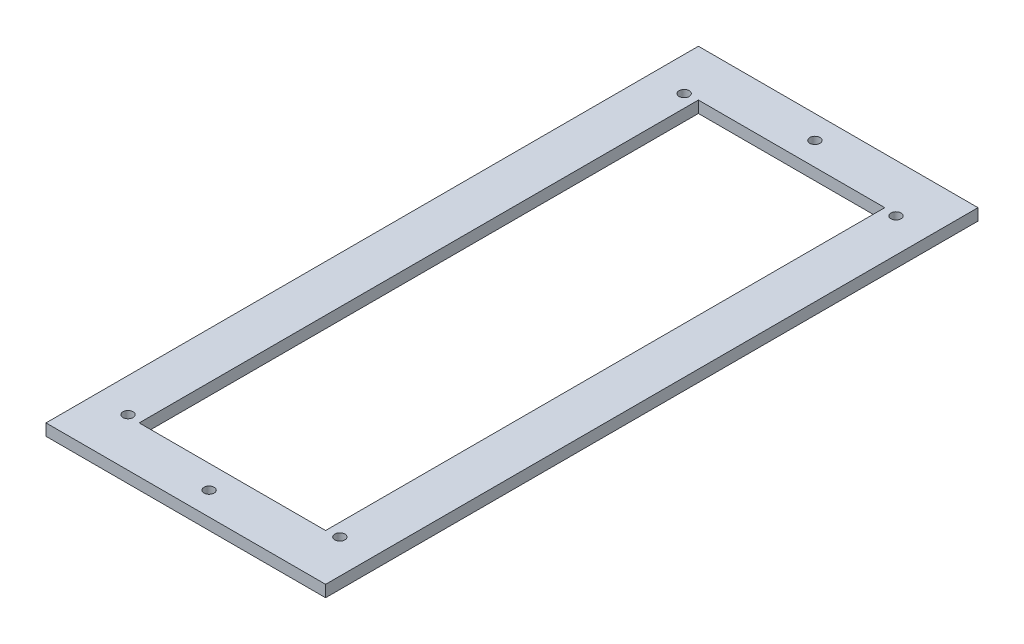
ISO-10303-21;
HEADER;
FILE_DESCRIPTION(('STEP AP214'),'2;1');
FILE_NAME('part.step','',(''),(''),'','','');
FILE_SCHEMA(('AUTOMOTIVE_DESIGN { 1 0 10303 214 1 1 1 1 }'));
ENDSEC;
DATA;
#1=APPLICATION_CONTEXT('core data for automotive mechanical design processes');
#2=APPLICATION_PROTOCOL_DEFINITION('international standard','automotive_design',2000,#1);
#3=PRODUCT_CONTEXT('',#1,'mechanical');
#4=PRODUCT('Part','Part','',(#3));
#5=PRODUCT_RELATED_PRODUCT_CATEGORY('part','',(#4));
#6=PRODUCT_DEFINITION_FORMATION('','',#4);
#7=PRODUCT_DEFINITION_CONTEXT('part definition',#1,'design');
#8=PRODUCT_DEFINITION('design','',#6,#7);
#9=PRODUCT_DEFINITION_SHAPE('','',#8);
#10=(LENGTH_UNIT() NAMED_UNIT(*) SI_UNIT(.MILLI.,.METRE.));
#11=(NAMED_UNIT(*) PLANE_ANGLE_UNIT() SI_UNIT($,.RADIAN.));
#12=(NAMED_UNIT(*) SI_UNIT($,.STERADIAN.) SOLID_ANGLE_UNIT());
#13=UNCERTAINTY_MEASURE_WITH_UNIT(LENGTH_MEASURE(1.E-05),#10,'distance_accuracy_value','');
#14=(GEOMETRIC_REPRESENTATION_CONTEXT(3) GLOBAL_UNCERTAINTY_ASSIGNED_CONTEXT((#13)) GLOBAL_UNIT_ASSIGNED_CONTEXT((#10,
#11,#12)) REPRESENTATION_CONTEXT('',''));
#15=CARTESIAN_POINT('',(0.,0.,0.));
#16=DIRECTION('',(0.,0.,1.));
#17=DIRECTION('',(1.,0.,0.));
#18=AXIS2_PLACEMENT_3D('',#15,#16,#17);
#19=CARTESIAN_POINT('',(-38.1,3.175,0.));
#20=DIRECTION('',(1.,0.,0.));
#21=DIRECTION('',(0.,0.,-1.));
#22=AXIS2_PLACEMENT_3D('',#19,#20,#21);
#23=PLANE('',#22);
#24=DIRECTION('',(0.,0.,1.));
#25=VECTOR('',#24,1.);
#26=CARTESIAN_POINT('',(-38.1,0.,0.));
#27=LINE('',#26,#25);
#28=CARTESIAN_POINT('',(-38.1,0.,0.));
#29=VERTEX_POINT('',#28);
#30=CARTESIAN_POINT('',(-38.1,0.,177.8));
#31=VERTEX_POINT('',#30);
#32=EDGE_CURVE('E143',#29,#31,#27,.T.);
#33=ORIENTED_EDGE('',*,*,#32,.T.);
#34=DIRECTION('',(0.,-1.,0.));
#35=VECTOR('',#34,1.);
#36=CARTESIAN_POINT('',(-38.1,3.175,177.8));
#37=LINE('',#36,#35);
#38=CARTESIAN_POINT('',(-38.1,3.175,177.8));
#39=VERTEX_POINT('',#38);
#40=EDGE_CURVE('E11',#39,#31,#37,.T.);
#41=ORIENTED_EDGE('',*,*,#40,.F.);
#42=DIRECTION('',(0.,0.,1.));
#43=VECTOR('',#42,1.);
#44=CARTESIAN_POINT('',(-38.1,3.175,0.));
#45=LINE('',#44,#43);
#46=CARTESIAN_POINT('',(-38.1,3.175,0.));
#47=VERTEX_POINT('',#46);
#48=EDGE_CURVE('E147',#47,#39,#45,.T.);
#49=ORIENTED_EDGE('',*,*,#48,.F.);
#50=DIRECTION('',(0.,-1.,0.));
#51=VECTOR('',#50,1.);
#52=CARTESIAN_POINT('',(-38.1,3.175,0.));
#53=LINE('',#52,#51);
#54=EDGE_CURVE('E160',#47,#29,#53,.T.);
#55=ORIENTED_EDGE('',*,*,#54,.T.);
#56=EDGE_LOOP('',(#33,#41,#49,#55));
#57=FACE_BOUND('',#56,.T.);
#58=ADVANCED_FACE('F41',(#57),#23,.F.);
#59=CARTESIAN_POINT('',(-38.1,3.175,177.8));
#60=DIRECTION('',(0.,0.,-1.));
#61=DIRECTION('',(-1.,0.,0.));
#62=AXIS2_PLACEMENT_3D('',#59,#60,#61);
#63=PLANE('',#62);
#64=DIRECTION('',(1.,0.,0.));
#65=VECTOR('',#64,1.);
#66=CARTESIAN_POINT('',(-38.1,0.,177.8));
#67=LINE('',#66,#65);
#68=CARTESIAN_POINT('',(38.1,0.,177.8));
#69=VERTEX_POINT('',#68);
#70=EDGE_CURVE('E163',#31,#69,#67,.T.);
#71=ORIENTED_EDGE('',*,*,#70,.T.);
#72=DIRECTION('',(0.,-1.,0.));
#73=VECTOR('',#72,1.);
#74=CARTESIAN_POINT('',(38.1,3.175,177.8));
#75=LINE('',#74,#73);
#76=CARTESIAN_POINT('',(38.1,3.175,177.8));
#77=VERTEX_POINT('',#76);
#78=EDGE_CURVE('E48',#77,#69,#75,.T.);
#79=ORIENTED_EDGE('',*,*,#78,.F.);
#80=DIRECTION('',(1.,0.,0.));
#81=VECTOR('',#80,1.);
#82=CARTESIAN_POINT('',(-38.1,3.175,177.8));
#83=LINE('',#82,#81);
#84=EDGE_CURVE('E150',#39,#77,#83,.T.);
#85=ORIENTED_EDGE('',*,*,#84,.F.);
#86=ORIENTED_EDGE('',*,*,#40,.T.);
#87=EDGE_LOOP('',(#71,#79,#85,#86));
#88=FACE_BOUND('',#87,.T.);
#89=ADVANCED_FACE('F193',(#88),#63,.F.);
#90=CARTESIAN_POINT('',(38.1,3.175,0.));
#91=DIRECTION('',(-1.,0.,0.));
#92=DIRECTION('',(0.,0.,1.));
#93=AXIS2_PLACEMENT_3D('',#90,#91,#92);
#94=PLANE('',#93);
#95=DIRECTION('',(0.,0.,-1.));
#96=VECTOR('',#95,1.);
#97=CARTESIAN_POINT('',(38.1,0.,0.));
#98=LINE('',#97,#96);
#99=CARTESIAN_POINT('',(38.1,0.,0.));
#100=VERTEX_POINT('',#99);
#101=EDGE_CURVE('E165',#69,#100,#98,.T.);
#102=ORIENTED_EDGE('',*,*,#101,.T.);
#103=DIRECTION('',(0.,-1.,0.));
#104=VECTOR('',#103,1.);
#105=CARTESIAN_POINT('',(38.1,3.175,0.));
#106=LINE('',#105,#104);
#107=CARTESIAN_POINT('',(38.1,3.175,0.));
#108=VERTEX_POINT('',#107);
#109=EDGE_CURVE('E172',#108,#100,#106,.T.);
#110=ORIENTED_EDGE('',*,*,#109,.F.);
#111=DIRECTION('',(0.,0.,-1.));
#112=VECTOR('',#111,1.);
#113=CARTESIAN_POINT('',(38.1,3.175,0.));
#114=LINE('',#113,#112);
#115=EDGE_CURVE('E154',#77,#108,#114,.T.);
#116=ORIENTED_EDGE('',*,*,#115,.F.);
#117=ORIENTED_EDGE('',*,*,#78,.T.);
#118=EDGE_LOOP('',(#102,#110,#116,#117));
#119=FACE_BOUND('',#118,.T.);
#120=ADVANCED_FACE('F179',(#119),#94,.F.);
#121=CARTESIAN_POINT('',(-38.1,3.175,0.));
#122=DIRECTION('',(0.,0.,1.));
#123=DIRECTION('',(1.,0.,0.));
#124=AXIS2_PLACEMENT_3D('',#121,#122,#123);
#125=PLANE('',#124);
#126=DIRECTION('',(-1.,0.,0.));
#127=VECTOR('',#126,1.);
#128=CARTESIAN_POINT('',(-38.1,0.,0.));
#129=LINE('',#128,#127);
#130=EDGE_CURVE('E151',#100,#29,#129,.T.);
#131=ORIENTED_EDGE('',*,*,#130,.T.);
#132=ORIENTED_EDGE('',*,*,#54,.F.);
#133=DIRECTION('',(-1.,0.,0.));
#134=VECTOR('',#133,1.);
#135=CARTESIAN_POINT('',(-38.1,3.175,0.));
#136=LINE('',#135,#134);
#137=EDGE_CURVE('E157',#108,#47,#136,.T.);
#138=ORIENTED_EDGE('',*,*,#137,.F.);
#139=ORIENTED_EDGE('',*,*,#109,.T.);
#140=EDGE_LOOP('',(#131,#132,#138,#139));
#141=FACE_BOUND('',#140,.T.);
#142=ADVANCED_FACE('F186',(#141),#125,.F.);
#143=CARTESIAN_POINT('',(0.,3.175,0.));
#144=DIRECTION('',(0.,1.,0.));
#145=DIRECTION('',(0.,0.,1.));
#146=AXIS2_PLACEMENT_3D('',#143,#144,#145);
#147=PLANE('',#146);
#148=CARTESIAN_POINT('',(28.8671,3.175,164.6809));
#149=DIRECTION('',(0.,1.,0.));
#150=DIRECTION('',(0.,0.,1.));
#151=AXIS2_PLACEMENT_3D('',#148,#149,#150);
#152=CIRCLE('',#151,1.3843);
#153=CARTESIAN_POINT('',(28.8671,3.175,166.0652));
#154=VERTEX_POINT('',#153);
#155=EDGE_CURVE('E251',#154,#154,#152,.T.);
#156=ORIENTED_EDGE('',*,*,#155,.F.);
#157=EDGE_LOOP('',(#156));
#158=FACE_BOUND('',#157,.T.);
#159=CARTESIAN_POINT('',(-28.8671,3.175,164.6809));
#160=DIRECTION('',(0.,1.,0.));
#161=DIRECTION('',(0.,0.,1.));
#162=AXIS2_PLACEMENT_3D('',#159,#160,#161);
#163=CIRCLE('',#162,1.3843);
#164=CARTESIAN_POINT('',(-28.8671,3.175,166.0652));
#165=VERTEX_POINT('',#164);
#166=EDGE_CURVE('E253',#165,#165,#163,.T.);
#167=ORIENTED_EDGE('',*,*,#166,.F.);
#168=EDGE_LOOP('',(#167));
#169=FACE_BOUND('',#168,.T.);
#170=CARTESIAN_POINT('',(28.8671,3.175,13.1191));
#171=DIRECTION('',(0.,1.,0.));
#172=DIRECTION('',(0.,0.,1.));
#173=AXIS2_PLACEMENT_3D('',#170,#171,#172);
#174=CIRCLE('',#173,1.3843);
#175=CARTESIAN_POINT('',(28.8671,3.175,14.5034));
#176=VERTEX_POINT('',#175);
#177=EDGE_CURVE('E259',#176,#176,#174,.T.);
#178=ORIENTED_EDGE('',*,*,#177,.F.);
#179=EDGE_LOOP('',(#178));
#180=FACE_BOUND('',#179,.T.);
#181=CARTESIAN_POINT('',(-28.8671,3.175,13.1191));
#182=DIRECTION('',(0.,1.,0.));
#183=DIRECTION('',(0.,0.,1.));
#184=AXIS2_PLACEMENT_3D('',#181,#182,#183);
#185=CIRCLE('',#184,1.3843);
#186=CARTESIAN_POINT('',(-28.8671,3.175,14.5034));
#187=VERTEX_POINT('',#186);
#188=EDGE_CURVE('E265',#187,#187,#185,.T.);
#189=ORIENTED_EDGE('',*,*,#188,.F.);
#190=EDGE_LOOP('',(#189));
#191=FACE_BOUND('',#190,.T.);
#192=CARTESIAN_POINT('',(0.,3.175,171.45));
#193=DIRECTION('',(0.,1.,0.));
#194=DIRECTION('',(0.,0.,1.));
#195=AXIS2_PLACEMENT_3D('',#192,#193,#194);
#196=CIRCLE('',#195,1.3843);
#197=CARTESIAN_POINT('',(0.,3.175,172.8343));
#198=VERTEX_POINT('',#197);
#199=EDGE_CURVE('E271',#198,#198,#196,.T.);
#200=ORIENTED_EDGE('',*,*,#199,.F.);
#201=EDGE_LOOP('',(#200));
#202=FACE_BOUND('',#201,.T.);
#203=CARTESIAN_POINT('',(0.,3.175,6.35));
#204=DIRECTION('',(0.,1.,0.));
#205=DIRECTION('',(0.,0.,1.));
#206=AXIS2_PLACEMENT_3D('',#203,#204,#205);
#207=CIRCLE('',#206,1.3843);
#208=CARTESIAN_POINT('',(0.,3.175,7.7343));
#209=VERTEX_POINT('',#208);
#210=EDGE_CURVE('E129',#209,#209,#207,.T.);
#211=ORIENTED_EDGE('',*,*,#210,.F.);
#212=EDGE_LOOP('',(#211));
#213=FACE_BOUND('',#212,.T.);
#214=DIRECTION('',(0.,0.,1.));
#215=VECTOR('',#214,1.);
#216=CARTESIAN_POINT('',(-25.4,3.175,12.7));
#217=LINE('',#216,#215);
#218=CARTESIAN_POINT('',(-25.4,3.175,12.7));
#219=VERTEX_POINT('',#218);
#220=CARTESIAN_POINT('',(-25.4,3.175,165.1));
#221=VERTEX_POINT('',#220);
#222=EDGE_CURVE('E55',#219,#221,#217,.T.);
#223=ORIENTED_EDGE('',*,*,#222,.F.);
#224=DIRECTION('',(-1.,0.,0.));
#225=VECTOR('',#224,1.);
#226=CARTESIAN_POINT('',(-25.4,3.175,12.7));
#227=LINE('',#226,#225);
#228=CARTESIAN_POINT('',(25.4,3.175,12.7));
#229=VERTEX_POINT('',#228);
#230=EDGE_CURVE('E123',#229,#219,#227,.T.);
#231=ORIENTED_EDGE('',*,*,#230,.F.);
#232=DIRECTION('',(0.,0.,-1.));
#233=VECTOR('',#232,1.);
#234=CARTESIAN_POINT('',(25.4,3.175,12.7));
#235=LINE('',#234,#233);
#236=CARTESIAN_POINT('',(25.4,3.175,165.1));
#237=VERTEX_POINT('',#236);
#238=EDGE_CURVE('E126',#237,#229,#235,.T.);
#239=ORIENTED_EDGE('',*,*,#238,.F.);
#240=DIRECTION('',(1.,0.,0.));
#241=VECTOR('',#240,1.);
#242=CARTESIAN_POINT('',(-25.4,3.175,165.1));
#243=LINE('',#242,#241);
#244=EDGE_CURVE('E136',#221,#237,#243,.T.);
#245=ORIENTED_EDGE('',*,*,#244,.F.);
#246=EDGE_LOOP('',(#223,#231,#239,#245));
#247=FACE_BOUND('',#246,.T.);
#248=ORIENTED_EDGE('',*,*,#48,.T.);
#249=ORIENTED_EDGE('',*,*,#84,.T.);
#250=ORIENTED_EDGE('',*,*,#115,.T.);
#251=ORIENTED_EDGE('',*,*,#137,.T.);
#252=EDGE_LOOP('',(#248,#249,#250,#251));
#253=FACE_BOUND('',#252,.T.);
#254=ADVANCED_FACE('F192',(#158,#169,#180,#191,#202,#213,#247,#253),#147,.T.);
#255=CARTESIAN_POINT('',(0.,0.,0.));
#256=DIRECTION('',(0.,1.,0.));
#257=DIRECTION('',(0.,0.,1.));
#258=AXIS2_PLACEMENT_3D('',#255,#256,#257);
#259=PLANE('',#258);
#260=CARTESIAN_POINT('',(28.8671,0.,164.6809));
#261=DIRECTION('',(0.,1.,0.));
#262=DIRECTION('',(0.,0.,1.));
#263=AXIS2_PLACEMENT_3D('',#260,#261,#262);
#264=CIRCLE('',#263,1.3843);
#265=CARTESIAN_POINT('',(28.8671,0.,166.0652));
#266=VERTEX_POINT('',#265);
#267=EDGE_CURVE('E248',#266,#266,#264,.T.);
#268=ORIENTED_EDGE('',*,*,#267,.T.);
#269=EDGE_LOOP('',(#268));
#270=FACE_BOUND('',#269,.T.);
#271=CARTESIAN_POINT('',(-28.8671,0.,164.6809));
#272=DIRECTION('',(0.,1.,0.));
#273=DIRECTION('',(0.,0.,1.));
#274=AXIS2_PLACEMENT_3D('',#271,#272,#273);
#275=CIRCLE('',#274,1.3843);
#276=CARTESIAN_POINT('',(-28.8671,0.,166.0652));
#277=VERTEX_POINT('',#276);
#278=EDGE_CURVE('E256',#277,#277,#275,.T.);
#279=ORIENTED_EDGE('',*,*,#278,.T.);
#280=EDGE_LOOP('',(#279));
#281=FACE_BOUND('',#280,.T.);
#282=CARTESIAN_POINT('',(28.8671,0.,13.1191));
#283=DIRECTION('',(0.,1.,0.));
#284=DIRECTION('',(0.,0.,1.));
#285=AXIS2_PLACEMENT_3D('',#282,#283,#284);
#286=CIRCLE('',#285,1.3843);
#287=CARTESIAN_POINT('',(28.8671,0.,14.5034));
#288=VERTEX_POINT('',#287);
#289=EDGE_CURVE('E262',#288,#288,#286,.T.);
#290=ORIENTED_EDGE('',*,*,#289,.T.);
#291=EDGE_LOOP('',(#290));
#292=FACE_BOUND('',#291,.T.);
#293=CARTESIAN_POINT('',(-28.8671,0.,13.1191));
#294=DIRECTION('',(0.,1.,0.));
#295=DIRECTION('',(0.,0.,1.));
#296=AXIS2_PLACEMENT_3D('',#293,#294,#295);
#297=CIRCLE('',#296,1.3843);
#298=CARTESIAN_POINT('',(-28.8671,0.,14.5034));
#299=VERTEX_POINT('',#298);
#300=EDGE_CURVE('E268',#299,#299,#297,.T.);
#301=ORIENTED_EDGE('',*,*,#300,.T.);
#302=EDGE_LOOP('',(#301));
#303=FACE_BOUND('',#302,.T.);
#304=CARTESIAN_POINT('',(0.,0.,171.45));
#305=DIRECTION('',(0.,1.,0.));
#306=DIRECTION('',(0.,0.,1.));
#307=AXIS2_PLACEMENT_3D('',#304,#305,#306);
#308=CIRCLE('',#307,1.3843);
#309=CARTESIAN_POINT('',(0.,0.,172.8343));
#310=VERTEX_POINT('',#309);
#311=EDGE_CURVE('E274',#310,#310,#308,.T.);
#312=ORIENTED_EDGE('',*,*,#311,.T.);
#313=EDGE_LOOP('',(#312));
#314=FACE_BOUND('',#313,.T.);
#315=CARTESIAN_POINT('',(0.,0.,6.35));
#316=DIRECTION('',(0.,1.,0.));
#317=DIRECTION('',(0.,0.,1.));
#318=AXIS2_PLACEMENT_3D('',#315,#316,#317);
#319=CIRCLE('',#318,1.3843);
#320=CARTESIAN_POINT('',(0.,0.,7.7343));
#321=VERTEX_POINT('',#320);
#322=EDGE_CURVE('E137',#321,#321,#319,.T.);
#323=ORIENTED_EDGE('',*,*,#322,.T.);
#324=EDGE_LOOP('',(#323));
#325=FACE_BOUND('',#324,.T.);
#326=DIRECTION('',(-1.,0.,0.));
#327=VECTOR('',#326,1.);
#328=CARTESIAN_POINT('',(-25.4,0.,12.7));
#329=LINE('',#328,#327);
#330=CARTESIAN_POINT('',(25.4,0.,12.7));
#331=VERTEX_POINT('',#330);
#332=CARTESIAN_POINT('',(-25.4,0.,12.7));
#333=VERTEX_POINT('',#332);
#334=EDGE_CURVE('E113',#331,#333,#329,.T.);
#335=ORIENTED_EDGE('',*,*,#334,.T.);
#336=DIRECTION('',(0.,0.,1.));
#337=VECTOR('',#336,1.);
#338=CARTESIAN_POINT('',(-25.4,0.,12.7));
#339=LINE('',#338,#337);
#340=CARTESIAN_POINT('',(-25.4,0.,165.1));
#341=VERTEX_POINT('',#340);
#342=EDGE_CURVE('E107',#333,#341,#339,.T.);
#343=ORIENTED_EDGE('',*,*,#342,.T.);
#344=DIRECTION('',(1.,0.,0.));
#345=VECTOR('',#344,1.);
#346=CARTESIAN_POINT('',(-25.4,0.,165.1));
#347=LINE('',#346,#345);
#348=CARTESIAN_POINT('',(25.4,0.,165.1));
#349=VERTEX_POINT('',#348);
#350=EDGE_CURVE('E116',#341,#349,#347,.T.);
#351=ORIENTED_EDGE('',*,*,#350,.T.);
#352=DIRECTION('',(0.,0.,-1.));
#353=VECTOR('',#352,1.);
#354=CARTESIAN_POINT('',(25.4,0.,12.7));
#355=LINE('',#354,#353);
#356=EDGE_CURVE('E63',#349,#331,#355,.T.);
#357=ORIENTED_EDGE('',*,*,#356,.T.);
#358=EDGE_LOOP('',(#335,#343,#351,#357));
#359=FACE_BOUND('',#358,.T.);
#360=ORIENTED_EDGE('',*,*,#32,.F.);
#361=ORIENTED_EDGE('',*,*,#130,.F.);
#362=ORIENTED_EDGE('',*,*,#101,.F.);
#363=ORIENTED_EDGE('',*,*,#70,.F.);
#364=EDGE_LOOP('',(#360,#361,#362,#363));
#365=FACE_BOUND('',#364,.T.);
#366=ADVANCED_FACE('F120',(#270,#281,#292,#303,#314,#325,#359,#365),#259,.F.);
#367=CARTESIAN_POINT('',(-25.4,0.,12.7));
#368=DIRECTION('',(-1.,0.,0.));
#369=DIRECTION('',(0.,0.,1.));
#370=AXIS2_PLACEMENT_3D('',#367,#368,#369);
#371=PLANE('',#370);
#372=ORIENTED_EDGE('',*,*,#222,.T.);
#373=DIRECTION('',(0.,1.,0.));
#374=VECTOR('',#373,1.);
#375=CARTESIAN_POINT('',(-25.4,0.,165.1));
#376=LINE('',#375,#374);
#377=EDGE_CURVE('E103',#341,#221,#376,.T.);
#378=ORIENTED_EDGE('',*,*,#377,.F.);
#379=ORIENTED_EDGE('',*,*,#342,.F.);
#380=DIRECTION('',(0.,1.,0.));
#381=VECTOR('',#380,1.);
#382=CARTESIAN_POINT('',(-25.4,0.,12.7));
#383=LINE('',#382,#381);
#384=EDGE_CURVE('E141',#333,#219,#383,.T.);
#385=ORIENTED_EDGE('',*,*,#384,.T.);
#386=EDGE_LOOP('',(#372,#378,#379,#385));
#387=FACE_BOUND('',#386,.T.);
#388=ADVANCED_FACE('F105',(#387),#371,.F.);
#389=CARTESIAN_POINT('',(-25.4,0.,12.7));
#390=DIRECTION('',(0.,0.,-1.));
#391=DIRECTION('',(-1.,0.,0.));
#392=AXIS2_PLACEMENT_3D('',#389,#390,#391);
#393=PLANE('',#392);
#394=ORIENTED_EDGE('',*,*,#230,.T.);
#395=ORIENTED_EDGE('',*,*,#384,.F.);
#396=ORIENTED_EDGE('',*,*,#334,.F.);
#397=DIRECTION('',(0.,1.,0.));
#398=VECTOR('',#397,1.);
#399=CARTESIAN_POINT('',(25.4,0.,12.7));
#400=LINE('',#399,#398);
#401=EDGE_CURVE('E144',#331,#229,#400,.T.);
#402=ORIENTED_EDGE('',*,*,#401,.T.);
#403=EDGE_LOOP('',(#394,#395,#396,#402));
#404=FACE_BOUND('',#403,.T.);
#405=ADVANCED_FACE('F211',(#404),#393,.F.);
#406=CARTESIAN_POINT('',(25.4,0.,12.7));
#407=DIRECTION('',(1.,0.,0.));
#408=DIRECTION('',(0.,0.,-1.));
#409=AXIS2_PLACEMENT_3D('',#406,#407,#408);
#410=PLANE('',#409);
#411=ORIENTED_EDGE('',*,*,#238,.T.);
#412=ORIENTED_EDGE('',*,*,#401,.F.);
#413=ORIENTED_EDGE('',*,*,#356,.F.);
#414=DIRECTION('',(0.,1.,0.));
#415=VECTOR('',#414,1.);
#416=CARTESIAN_POINT('',(25.4,0.,165.1));
#417=LINE('',#416,#415);
#418=EDGE_CURVE('E112',#349,#237,#417,.T.);
#419=ORIENTED_EDGE('',*,*,#418,.T.);
#420=EDGE_LOOP('',(#411,#412,#413,#419));
#421=FACE_BOUND('',#420,.T.);
#422=ADVANCED_FACE('F215',(#421),#410,.F.);
#423=CARTESIAN_POINT('',(-25.4,0.,165.1));
#424=DIRECTION('',(0.,0.,1.));
#425=DIRECTION('',(1.,0.,0.));
#426=AXIS2_PLACEMENT_3D('',#423,#424,#425);
#427=PLANE('',#426);
#428=ORIENTED_EDGE('',*,*,#244,.T.);
#429=ORIENTED_EDGE('',*,*,#418,.F.);
#430=ORIENTED_EDGE('',*,*,#350,.F.);
#431=ORIENTED_EDGE('',*,*,#377,.T.);
#432=EDGE_LOOP('',(#428,#429,#430,#431));
#433=FACE_BOUND('',#432,.T.);
#434=ADVANCED_FACE('F117',(#433),#427,.F.);
#435=CARTESIAN_POINT('',(0.,0.,6.35));
#436=DIRECTION('',(0.,1.,0.));
#437=DIRECTION('',(0.,0.,1.));
#438=AXIS2_PLACEMENT_3D('',#435,#436,#437);
#439=CYLINDRICAL_SURFACE('',#438,1.3843);
#440=ORIENTED_EDGE('',*,*,#322,.F.);
#441=EDGE_LOOP('',(#440));
#442=FACE_BOUND('',#441,.T.);
#443=ORIENTED_EDGE('',*,*,#210,.T.);
#444=EDGE_LOOP('',(#443));
#445=FACE_BOUND('',#444,.T.);
#446=ADVANCED_FACE('F214',(#442,#445),#439,.F.);
#447=CARTESIAN_POINT('',(0.,0.,171.45));
#448=DIRECTION('',(0.,1.,0.));
#449=DIRECTION('',(0.,0.,1.));
#450=AXIS2_PLACEMENT_3D('',#447,#448,#449);
#451=CYLINDRICAL_SURFACE('',#450,1.3843);
#452=ORIENTED_EDGE('',*,*,#311,.F.);
#453=EDGE_LOOP('',(#452));
#454=FACE_BOUND('',#453,.T.);
#455=ORIENTED_EDGE('',*,*,#199,.T.);
#456=EDGE_LOOP('',(#455));
#457=FACE_BOUND('',#456,.T.);
#458=ADVANCED_FACE('F223',(#454,#457),#451,.F.);
#459=CARTESIAN_POINT('',(-28.8671,0.,13.1191));
#460=DIRECTION('',(0.,1.,0.));
#461=DIRECTION('',(0.,0.,1.));
#462=AXIS2_PLACEMENT_3D('',#459,#460,#461);
#463=CYLINDRICAL_SURFACE('',#462,1.3843);
#464=ORIENTED_EDGE('',*,*,#300,.F.);
#465=EDGE_LOOP('',(#464));
#466=FACE_BOUND('',#465,.T.);
#467=ORIENTED_EDGE('',*,*,#188,.T.);
#468=EDGE_LOOP('',(#467));
#469=FACE_BOUND('',#468,.T.);
#470=ADVANCED_FACE('F227',(#466,#469),#463,.F.);
#471=CARTESIAN_POINT('',(28.8671,0.,13.1191));
#472=DIRECTION('',(0.,1.,0.));
#473=DIRECTION('',(0.,0.,1.));
#474=AXIS2_PLACEMENT_3D('',#471,#472,#473);
#475=CYLINDRICAL_SURFACE('',#474,1.3843);
#476=ORIENTED_EDGE('',*,*,#289,.F.);
#477=EDGE_LOOP('',(#476));
#478=FACE_BOUND('',#477,.T.);
#479=ORIENTED_EDGE('',*,*,#177,.T.);
#480=EDGE_LOOP('',(#479));
#481=FACE_BOUND('',#480,.T.);
#482=ADVANCED_FACE('F231',(#478,#481),#475,.F.);
#483=CARTESIAN_POINT('',(-28.8671,0.,164.6809));
#484=DIRECTION('',(0.,1.,0.));
#485=DIRECTION('',(0.,0.,1.));
#486=AXIS2_PLACEMENT_3D('',#483,#484,#485);
#487=CYLINDRICAL_SURFACE('',#486,1.3843);
#488=ORIENTED_EDGE('',*,*,#278,.F.);
#489=EDGE_LOOP('',(#488));
#490=FACE_BOUND('',#489,.T.);
#491=ORIENTED_EDGE('',*,*,#166,.T.);
#492=EDGE_LOOP('',(#491));
#493=FACE_BOUND('',#492,.T.);
#494=ADVANCED_FACE('F235',(#490,#493),#487,.F.);
#495=CARTESIAN_POINT('',(28.8671,0.,164.6809));
#496=DIRECTION('',(0.,1.,0.));
#497=DIRECTION('',(0.,0.,1.));
#498=AXIS2_PLACEMENT_3D('',#495,#496,#497);
#499=CYLINDRICAL_SURFACE('',#498,1.3843);
#500=ORIENTED_EDGE('',*,*,#267,.F.);
#501=EDGE_LOOP('',(#500));
#502=FACE_BOUND('',#501,.T.);
#503=ORIENTED_EDGE('',*,*,#155,.T.);
#504=EDGE_LOOP('',(#503));
#505=FACE_BOUND('',#504,.T.);
#506=ADVANCED_FACE('F239',(#502,#505),#499,.F.);
#507=CLOSED_SHELL('',(#58,#89,#120,#142,#254,#366,#388,#405,#422,#434,#446,#458,#470,#482,#494,#506));
#508=MANIFOLD_SOLID_BREP('B2',#507);
#509=ADVANCED_BREP_SHAPE_REPRESENTATION('',(#18,#508),#14);
#510=SHAPE_DEFINITION_REPRESENTATION(#9,#509);
ENDSEC;
END-ISO-10303-21;
